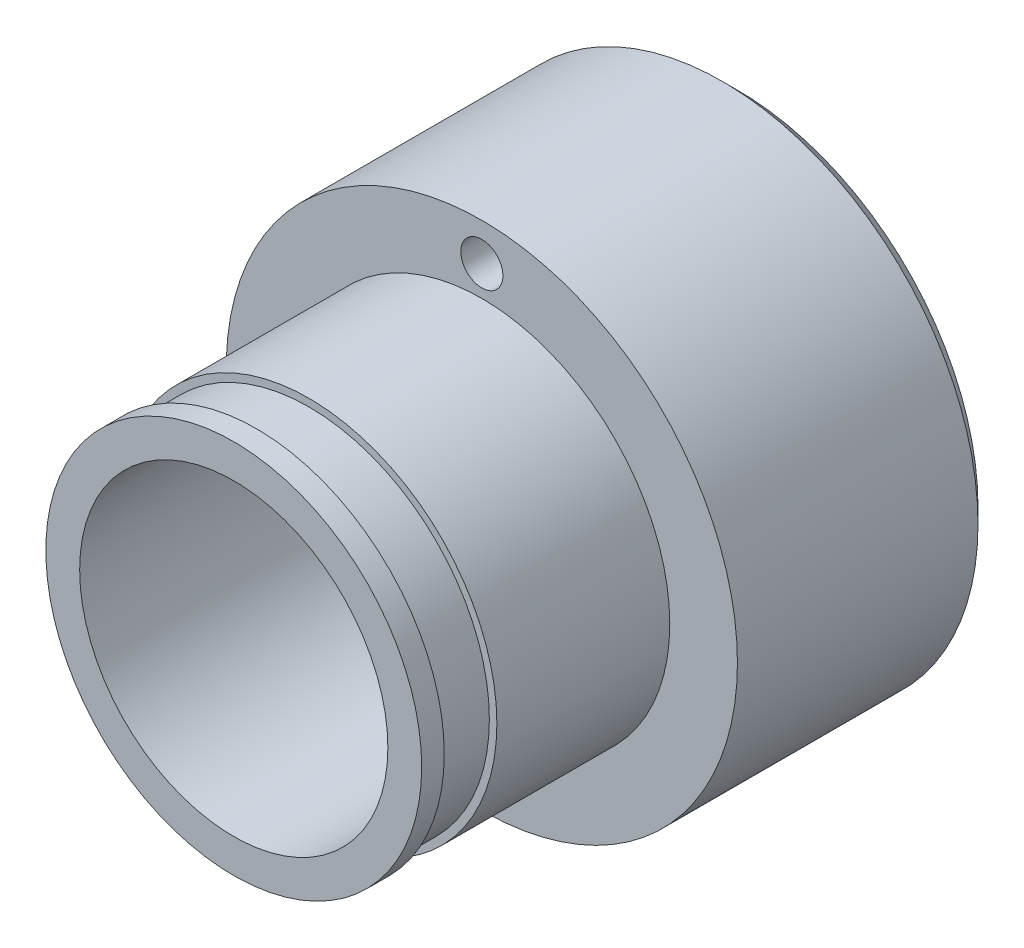
ISO-10303-21;
HEADER;
FILE_DESCRIPTION(('STEP AP214'),'2;1');
FILE_NAME('part.step','',(''),(''),'','','');
FILE_SCHEMA(('AUTOMOTIVE_DESIGN { 1 0 10303 214 1 1 1 1 }'));
ENDSEC;
DATA;
#1=APPLICATION_CONTEXT('core data for automotive mechanical design processes');
#2=APPLICATION_PROTOCOL_DEFINITION('international standard','automotive_design',2000,#1);
#3=PRODUCT_CONTEXT('',#1,'mechanical');
#4=PRODUCT('Part','Part','',(#3));
#5=PRODUCT_RELATED_PRODUCT_CATEGORY('part','',(#4));
#6=PRODUCT_DEFINITION_FORMATION('','',#4);
#7=PRODUCT_DEFINITION_CONTEXT('part definition',#1,'design');
#8=PRODUCT_DEFINITION('design','',#6,#7);
#9=PRODUCT_DEFINITION_SHAPE('','',#8);
#10=(LENGTH_UNIT() NAMED_UNIT(*) SI_UNIT(.MILLI.,.METRE.));
#11=(NAMED_UNIT(*) PLANE_ANGLE_UNIT() SI_UNIT($,.RADIAN.));
#12=(NAMED_UNIT(*) SI_UNIT($,.STERADIAN.) SOLID_ANGLE_UNIT());
#13=UNCERTAINTY_MEASURE_WITH_UNIT(LENGTH_MEASURE(1.E-05),#10,'distance_accuracy_value','');
#14=(GEOMETRIC_REPRESENTATION_CONTEXT(3) GLOBAL_UNCERTAINTY_ASSIGNED_CONTEXT((#13)) GLOBAL_UNIT_ASSIGNED_CONTEXT((#10,
#11,#12)) REPRESENTATION_CONTEXT('',''));
#15=CARTESIAN_POINT('',(0.,0.,0.));
#16=DIRECTION('',(0.,0.,1.));
#17=DIRECTION('',(1.,0.,0.));
#18=AXIS2_PLACEMENT_3D('',#15,#16,#17);
#19=CARTESIAN_POINT('',(0.,0.,17.));
#20=DIRECTION('',(0.,0.,-1.));
#21=DIRECTION('',(-1.,0.,0.));
#22=AXIS2_PLACEMENT_3D('',#19,#20,#21);
#23=CYLINDRICAL_SURFACE('',#22,17.);
#24=CARTESIAN_POINT('',(0.,0.,1.));
#25=DIRECTION('',(0.,0.,1.));
#26=DIRECTION('',(1.,0.,0.));
#27=AXIS2_PLACEMENT_3D('',#24,#25,#26);
#28=CIRCLE('',#27,17.);
#29=CARTESIAN_POINT('',(17.,0.,1.));
#30=VERTEX_POINT('',#29);
#31=EDGE_CURVE('E57',#30,#30,#28,.T.);
#32=ORIENTED_EDGE('',*,*,#31,.T.);
#33=EDGE_LOOP('',(#32));
#34=FACE_BOUND('',#33,.T.);
#35=CARTESIAN_POINT('',(0.,0.,17.));
#36=DIRECTION('',(0.,0.,1.));
#37=DIRECTION('',(1.,0.,0.));
#38=AXIS2_PLACEMENT_3D('',#35,#36,#37);
#39=CIRCLE('',#38,17.);
#40=CARTESIAN_POINT('',(17.,0.,17.));
#41=VERTEX_POINT('',#40);
#42=EDGE_CURVE('E115',#41,#41,#39,.T.);
#43=ORIENTED_EDGE('',*,*,#42,.F.);
#44=EDGE_LOOP('',(#43));
#45=FACE_BOUND('',#44,.T.);
#46=ADVANCED_FACE('F49',(#34,#45),#23,.T.);
#47=CARTESIAN_POINT('',(0.,0.,17.));
#48=DIRECTION('',(0.,0.,1.));
#49=DIRECTION('',(1.,0.,0.));
#50=AXIS2_PLACEMENT_3D('',#47,#48,#49);
#51=PLANE('',#50);
#52=CARTESIAN_POINT('',(0.,14.5,17.));
#53=DIRECTION('',(0.,0.,1.));
#54=DIRECTION('',(1.,0.,0.));
#55=AXIS2_PLACEMENT_3D('',#52,#53,#54);
#56=CIRCLE('',#55,1.4);
#57=CARTESIAN_POINT('',(1.4,14.5,17.));
#58=VERTEX_POINT('',#57);
#59=EDGE_CURVE('E71',#58,#58,#56,.T.);
#60=ORIENTED_EDGE('',*,*,#59,.F.);
#61=EDGE_LOOP('',(#60));
#62=FACE_BOUND('',#61,.T.);
#63=CARTESIAN_POINT('',(0.,0.,17.));
#64=DIRECTION('',(0.,0.,1.));
#65=DIRECTION('',(1.,0.,0.));
#66=AXIS2_PLACEMENT_3D('',#63,#64,#65);
#67=CIRCLE('',#66,12.5);
#68=CARTESIAN_POINT('',(12.5,0.,17.));
#69=VERTEX_POINT('',#68);
#70=EDGE_CURVE('E112',#69,#69,#67,.T.);
#71=ORIENTED_EDGE('',*,*,#70,.F.);
#72=EDGE_LOOP('',(#71));
#73=FACE_BOUND('',#72,.T.);
#74=ORIENTED_EDGE('',*,*,#42,.T.);
#75=EDGE_LOOP('',(#74));
#76=FACE_BOUND('',#75,.T.);
#77=ADVANCED_FACE('F133',(#62,#73,#76),#51,.T.);
#78=CARTESIAN_POINT('',(0.,0.,0.));
#79=DIRECTION('',(0.,0.,1.));
#80=DIRECTION('',(1.,0.,0.));
#81=AXIS2_PLACEMENT_3D('',#78,#79,#80);
#82=PLANE('',#81);
#83=CARTESIAN_POINT('',(0.,0.,0.));
#84=DIRECTION('',(0.,0.,1.));
#85=DIRECTION('',(1.,0.,0.));
#86=AXIS2_PLACEMENT_3D('',#83,#84,#85);
#87=CIRCLE('',#86,16.);
#88=CARTESIAN_POINT('',(16.,0.,0.));
#89=VERTEX_POINT('',#88);
#90=EDGE_CURVE('E11',#89,#89,#87,.F.);
#91=ORIENTED_EDGE('',*,*,#90,.T.);
#92=EDGE_LOOP('',(#91));
#93=FACE_BOUND('',#92,.T.);
#94=ADVANCED_FACE('F137',(#93),#82,.F.);
#95=CARTESIAN_POINT('',(0.,0.,28.5));
#96=DIRECTION('',(0.,0.,-1.));
#97=DIRECTION('',(-1.,0.,0.));
#98=AXIS2_PLACEMENT_3D('',#95,#96,#97);
#99=CYLINDRICAL_SURFACE('',#98,12.5);
#100=CARTESIAN_POINT('',(0.,0.,28.5));
#101=DIRECTION('',(0.,0.,1.));
#102=DIRECTION('',(1.,0.,0.));
#103=AXIS2_PLACEMENT_3D('',#100,#101,#102);
#104=CIRCLE('',#103,12.5);
#105=CARTESIAN_POINT('',(12.5,0.,28.5));
#106=VERTEX_POINT('',#105);
#107=EDGE_CURVE('E108',#106,#106,#104,.T.);
#108=ORIENTED_EDGE('',*,*,#107,.F.);
#109=EDGE_LOOP('',(#108));
#110=FACE_BOUND('',#109,.T.);
#111=ORIENTED_EDGE('',*,*,#70,.T.);
#112=EDGE_LOOP('',(#111));
#113=FACE_BOUND('',#112,.T.);
#114=ADVANCED_FACE('F141',(#110,#113),#99,.T.);
#115=CARTESIAN_POINT('',(0.,0.,28.5));
#116=DIRECTION('',(0.,0.,1.));
#117=DIRECTION('',(1.,0.,0.));
#118=AXIS2_PLACEMENT_3D('',#115,#116,#117);
#119=PLANE('',#118);
#120=CARTESIAN_POINT('',(0.,0.,28.5));
#121=DIRECTION('',(0.,0.,1.));
#122=DIRECTION('',(1.,0.,0.));
#123=AXIS2_PLACEMENT_3D('',#120,#121,#122);
#124=CIRCLE('',#123,12.);
#125=CARTESIAN_POINT('',(12.,0.,28.5));
#126=VERTEX_POINT('',#125);
#127=EDGE_CURVE('E109',#126,#126,#124,.T.);
#128=ORIENTED_EDGE('',*,*,#127,.F.);
#129=EDGE_LOOP('',(#128));
#130=FACE_BOUND('',#129,.T.);
#131=ORIENTED_EDGE('',*,*,#107,.T.);
#132=EDGE_LOOP('',(#131));
#133=FACE_BOUND('',#132,.T.);
#134=ADVANCED_FACE('F146',(#130,#133),#119,.T.);
#135=CARTESIAN_POINT('',(0.,0.,32.));
#136=DIRECTION('',(0.,0.,-1.));
#137=DIRECTION('',(-1.,0.,0.));
#138=AXIS2_PLACEMENT_3D('',#135,#136,#137);
#139=CYLINDRICAL_SURFACE('',#138,12.);
#140=CARTESIAN_POINT('',(0.,0.,32.));
#141=DIRECTION('',(0.,0.,1.));
#142=DIRECTION('',(1.,0.,0.));
#143=AXIS2_PLACEMENT_3D('',#140,#141,#142);
#144=CIRCLE('',#143,12.);
#145=CARTESIAN_POINT('',(12.,0.,32.));
#146=VERTEX_POINT('',#145);
#147=EDGE_CURVE('E103',#146,#146,#144,.T.);
#148=ORIENTED_EDGE('',*,*,#147,.F.);
#149=EDGE_LOOP('',(#148));
#150=FACE_BOUND('',#149,.T.);
#151=ORIENTED_EDGE('',*,*,#127,.T.);
#152=EDGE_LOOP('',(#151));
#153=FACE_BOUND('',#152,.T.);
#154=ADVANCED_FACE('F150',(#150,#153),#139,.T.);
#155=CARTESIAN_POINT('',(0.,0.,33.5));
#156=DIRECTION('',(0.,0.,-1.));
#157=DIRECTION('',(-1.,0.,0.));
#158=AXIS2_PLACEMENT_3D('',#155,#156,#157);
#159=CYLINDRICAL_SURFACE('',#158,12.5);
#160=CARTESIAN_POINT('',(0.,0.,33.5));
#161=DIRECTION('',(0.,0.,1.));
#162=DIRECTION('',(1.,0.,0.));
#163=AXIS2_PLACEMENT_3D('',#160,#161,#162);
#164=CIRCLE('',#163,12.5);
#165=CARTESIAN_POINT('',(12.5,0.,33.5));
#166=VERTEX_POINT('',#165);
#167=EDGE_CURVE('E100',#166,#166,#164,.T.);
#168=ORIENTED_EDGE('',*,*,#167,.F.);
#169=EDGE_LOOP('',(#168));
#170=FACE_BOUND('',#169,.T.);
#171=CARTESIAN_POINT('',(0.,0.,32.));
#172=DIRECTION('',(0.,0.,1.));
#173=DIRECTION('',(1.,0.,0.));
#174=AXIS2_PLACEMENT_3D('',#171,#172,#173);
#175=CIRCLE('',#174,12.5);
#176=CARTESIAN_POINT('',(12.5,0.,32.));
#177=VERTEX_POINT('',#176);
#178=EDGE_CURVE('E99',#177,#177,#175,.T.);
#179=ORIENTED_EDGE('',*,*,#178,.T.);
#180=EDGE_LOOP('',(#179));
#181=FACE_BOUND('',#180,.T.);
#182=ADVANCED_FACE('F154',(#170,#181),#159,.T.);
#183=CARTESIAN_POINT('',(0.,0.,33.5));
#184=DIRECTION('',(0.,0.,1.));
#185=DIRECTION('',(1.,0.,0.));
#186=AXIS2_PLACEMENT_3D('',#183,#184,#185);
#187=PLANE('',#186);
#188=CARTESIAN_POINT('',(0.,0.,33.5));
#189=DIRECTION('',(0.,0.,1.));
#190=DIRECTION('',(1.,0.,0.));
#191=AXIS2_PLACEMENT_3D('',#188,#189,#190);
#192=CIRCLE('',#191,10.25);
#193=CARTESIAN_POINT('',(10.25,0.,33.5));
#194=VERTEX_POINT('',#193);
#195=EDGE_CURVE('E96',#194,#194,#192,.T.);
#196=ORIENTED_EDGE('',*,*,#195,.F.);
#197=EDGE_LOOP('',(#196));
#198=FACE_BOUND('',#197,.T.);
#199=ORIENTED_EDGE('',*,*,#167,.T.);
#200=EDGE_LOOP('',(#199));
#201=FACE_BOUND('',#200,.T.);
#202=ADVANCED_FACE('F158',(#198,#201),#187,.T.);
#203=CARTESIAN_POINT('',(0.,0.,32.));
#204=DIRECTION('',(0.,0.,1.));
#205=DIRECTION('',(1.,0.,0.));
#206=AXIS2_PLACEMENT_3D('',#203,#204,#205);
#207=PLANE('',#206);
#208=ORIENTED_EDGE('',*,*,#147,.T.);
#209=EDGE_LOOP('',(#208));
#210=FACE_BOUND('',#209,.T.);
#211=ORIENTED_EDGE('',*,*,#178,.F.);
#212=EDGE_LOOP('',(#211));
#213=FACE_BOUND('',#212,.T.);
#214=ADVANCED_FACE('F160',(#210,#213),#207,.F.);
#215=CARTESIAN_POINT('',(0.,0.,3.5));
#216=DIRECTION('',(0.,0.,1.));
#217=DIRECTION('',(1.,0.,0.));
#218=AXIS2_PLACEMENT_3D('',#215,#216,#217);
#219=CYLINDRICAL_SURFACE('',#218,10.25);
#220=CARTESIAN_POINT('',(0.,0.,5.5));
#221=DIRECTION('',(0.,0.,1.));
#222=DIRECTION('',(1.,0.,0.));
#223=AXIS2_PLACEMENT_3D('',#220,#221,#222);
#224=CIRCLE('',#223,10.25);
#225=CARTESIAN_POINT('',(10.25,0.,5.5));
#226=VERTEX_POINT('',#225);
#227=EDGE_CURVE('E74',#226,#226,#224,.T.);
#228=ORIENTED_EDGE('',*,*,#227,.F.);
#229=EDGE_LOOP('',(#228));
#230=FACE_BOUND('',#229,.T.);
#231=ORIENTED_EDGE('',*,*,#195,.T.);
#232=EDGE_LOOP('',(#231));
#233=FACE_BOUND('',#232,.T.);
#234=ADVANCED_FACE('F163',(#230,#233),#219,.F.);
#235=CARTESIAN_POINT('',(0.,0.,5.5));
#236=DIRECTION('',(0.,0.,1.));
#237=DIRECTION('',(1.,0.,0.));
#238=AXIS2_PLACEMENT_3D('',#235,#236,#237);
#239=PLANE('',#238);
#240=CARTESIAN_POINT('',(0.,0.,5.5));
#241=DIRECTION('',(0.,0.,1.));
#242=DIRECTION('',(1.,0.,0.));
#243=AXIS2_PLACEMENT_3D('',#240,#241,#242);
#244=CIRCLE('',#243,12.);
#245=CARTESIAN_POINT('',(12.,0.,5.5));
#246=VERTEX_POINT('',#245);
#247=EDGE_CURVE('E82',#246,#246,#244,.T.);
#248=ORIENTED_EDGE('',*,*,#247,.F.);
#249=EDGE_LOOP('',(#248));
#250=FACE_BOUND('',#249,.T.);
#251=ORIENTED_EDGE('',*,*,#227,.T.);
#252=EDGE_LOOP('',(#251));
#253=FACE_BOUND('',#252,.T.);
#254=ADVANCED_FACE('F170',(#250,#253),#239,.F.);
#255=CARTESIAN_POINT('',(0.,0.,3.5));
#256=DIRECTION('',(0.,0.,1.));
#257=DIRECTION('',(1.,0.,0.));
#258=AXIS2_PLACEMENT_3D('',#255,#256,#257);
#259=PLANE('',#258);
#260=CARTESIAN_POINT('',(0.,0.,3.5));
#261=DIRECTION('',(0.,0.,1.));
#262=DIRECTION('',(1.,0.,0.));
#263=AXIS2_PLACEMENT_3D('',#260,#261,#262);
#264=CIRCLE('',#263,12.);
#265=CARTESIAN_POINT('',(12.,0.,3.5));
#266=VERTEX_POINT('',#265);
#267=EDGE_CURVE('E80',#266,#266,#264,.T.);
#268=ORIENTED_EDGE('',*,*,#267,.T.);
#269=EDGE_LOOP('',(#268));
#270=FACE_BOUND('',#269,.T.);
#271=CARTESIAN_POINT('',(0.,0.,3.5));
#272=DIRECTION('',(0.,0.,1.));
#273=DIRECTION('',(1.,0.,0.));
#274=AXIS2_PLACEMENT_3D('',#271,#272,#273);
#275=CIRCLE('',#274,10.25);
#276=CARTESIAN_POINT('',(10.25,0.,3.5));
#277=VERTEX_POINT('',#276);
#278=EDGE_CURVE('E70',#277,#277,#275,.T.);
#279=ORIENTED_EDGE('',*,*,#278,.F.);
#280=EDGE_LOOP('',(#279));
#281=FACE_BOUND('',#280,.T.);
#282=ADVANCED_FACE('F187',(#270,#281),#259,.T.);
#283=CARTESIAN_POINT('',(0.,0.,5.5));
#284=DIRECTION('',(0.,0.,-1.));
#285=DIRECTION('',(-1.,0.,0.));
#286=AXIS2_PLACEMENT_3D('',#283,#284,#285);
#287=CYLINDRICAL_SURFACE('',#286,12.);
#288=ORIENTED_EDGE('',*,*,#247,.T.);
#289=EDGE_LOOP('',(#288));
#290=FACE_BOUND('',#289,.T.);
#291=ORIENTED_EDGE('',*,*,#267,.F.);
#292=EDGE_LOOP('',(#291));
#293=FACE_BOUND('',#292,.T.);
#294=ADVANCED_FACE('F176',(#290,#293),#287,.F.);
#295=CARTESIAN_POINT('',(0.,0.,3.5));
#296=DIRECTION('',(0.,0.,1.));
#297=DIRECTION('',(1.,0.,0.));
#298=AXIS2_PLACEMENT_3D('',#295,#296,#297);
#299=PLANE('',#298);
#300=CARTESIAN_POINT('',(0.,0.,3.5));
#301=DIRECTION('',(0.,0.,1.));
#302=DIRECTION('',(1.,0.,0.));
#303=AXIS2_PLACEMENT_3D('',#300,#301,#302);
#304=CIRCLE('',#303,6.75);
#305=CARTESIAN_POINT('',(6.75,0.,3.5));
#306=VERTEX_POINT('',#305);
#307=EDGE_CURVE('E85',#306,#306,#304,.T.);
#308=ORIENTED_EDGE('',*,*,#307,.T.);
#309=EDGE_LOOP('',(#308));
#310=FACE_BOUND('',#309,.T.);
#311=ADVANCED_FACE('F172',(#310),#299,.T.);
#312=CARTESIAN_POINT('',(0.,0.,2.));
#313=DIRECTION('',(0.,0.,1.));
#314=DIRECTION('',(1.,0.,0.));
#315=AXIS2_PLACEMENT_3D('',#312,#313,#314);
#316=CYLINDRICAL_SURFACE('',#315,6.75);
#317=CARTESIAN_POINT('',(0.,0.,2.));
#318=DIRECTION('',(0.,0.,1.));
#319=DIRECTION('',(1.,0.,0.));
#320=AXIS2_PLACEMENT_3D('',#317,#318,#319);
#321=CIRCLE('',#320,6.75);
#322=CARTESIAN_POINT('',(6.75,0.,2.));
#323=VERTEX_POINT('',#322);
#324=EDGE_CURVE('E88',#323,#323,#321,.T.);
#325=ORIENTED_EDGE('',*,*,#324,.T.);
#326=EDGE_LOOP('',(#325));
#327=FACE_BOUND('',#326,.T.);
#328=ORIENTED_EDGE('',*,*,#307,.F.);
#329=EDGE_LOOP('',(#328));
#330=FACE_BOUND('',#329,.T.);
#331=ADVANCED_FACE('F175',(#327,#330),#316,.T.);
#332=CARTESIAN_POINT('',(0.,0.,2.));
#333=DIRECTION('',(0.,0.,1.));
#334=DIRECTION('',(1.,0.,0.));
#335=AXIS2_PLACEMENT_3D('',#332,#333,#334);
#336=PLANE('',#335);
#337=ORIENTED_EDGE('',*,*,#324,.F.);
#338=EDGE_LOOP('',(#337));
#339=FACE_BOUND('',#338,.T.);
#340=CARTESIAN_POINT('',(0.,0.,2.));
#341=DIRECTION('',(0.,0.,1.));
#342=DIRECTION('',(1.,0.,0.));
#343=AXIS2_PLACEMENT_3D('',#340,#341,#342);
#344=CIRCLE('',#343,10.25);
#345=CARTESIAN_POINT('',(10.25,0.,2.));
#346=VERTEX_POINT('',#345);
#347=EDGE_CURVE('E91',#346,#346,#344,.T.);
#348=ORIENTED_EDGE('',*,*,#347,.T.);
#349=EDGE_LOOP('',(#348));
#350=FACE_BOUND('',#349,.T.);
#351=ADVANCED_FACE('F178',(#339,#350),#336,.T.);
#352=ORIENTED_EDGE('',*,*,#347,.F.);
#353=EDGE_LOOP('',(#352));
#354=FACE_BOUND('',#353,.T.);
#355=ORIENTED_EDGE('',*,*,#278,.T.);
#356=EDGE_LOOP('',(#355));
#357=FACE_BOUND('',#356,.T.);
#358=ADVANCED_FACE('F64',(#354,#357),#219,.F.);
#359=CARTESIAN_POINT('',(0.,14.5,5.));
#360=DIRECTION('',(0.,0.,1.));
#361=DIRECTION('',(1.,0.,0.));
#362=AXIS2_PLACEMENT_3D('',#359,#360,#361);
#363=CONICAL_SURFACE('',#362,1.4,1.02974425867665);
#364=CARTESIAN_POINT('',(0.,14.5,4.15879513336142));
#365=VERTEX_POINT('',#364);
#366=VERTEX_LOOP('',#365);
#367=FACE_BOUND('',#366,.T.);
#368=CARTESIAN_POINT('',(0.,14.5,5.));
#369=DIRECTION('',(0.,0.,1.));
#370=DIRECTION('',(1.,0.,0.));
#371=AXIS2_PLACEMENT_3D('',#368,#369,#370);
#372=CIRCLE('',#371,1.4);
#373=CARTESIAN_POINT('',(1.4,14.5,5.));
#374=VERTEX_POINT('',#373);
#375=EDGE_CURVE('E68',#374,#374,#372,.T.);
#376=ORIENTED_EDGE('',*,*,#375,.T.);
#377=EDGE_LOOP('',(#376));
#378=FACE_BOUND('',#377,.T.);
#379=ADVANCED_FACE('F60',(#367,#378),#363,.F.);
#380=CARTESIAN_POINT('',(0.,14.5,17.));
#381=DIRECTION('',(0.,0.,1.));
#382=DIRECTION('',(1.,0.,0.));
#383=AXIS2_PLACEMENT_3D('',#380,#381,#382);
#384=CYLINDRICAL_SURFACE('',#383,1.4);
#385=ORIENTED_EDGE('',*,*,#375,.F.);
#386=EDGE_LOOP('',(#385));
#387=FACE_BOUND('',#386,.T.);
#388=ORIENTED_EDGE('',*,*,#59,.T.);
#389=EDGE_LOOP('',(#388));
#390=FACE_BOUND('',#389,.T.);
#391=ADVANCED_FACE('F63',(#387,#390),#384,.F.);
#392=CARTESIAN_POINT('',(0.,0.,1.));
#393=DIRECTION('',(0.,0.,1.));
#394=DIRECTION('',(1.,0.,0.));
#395=AXIS2_PLACEMENT_3D('',#392,#393,#394);
#396=CONICAL_SURFACE('',#395,17.,0.78539816339745);
#397=ORIENTED_EDGE('',*,*,#90,.F.);
#398=EDGE_LOOP('',(#397));
#399=FACE_BOUND('',#398,.T.);
#400=ORIENTED_EDGE('',*,*,#31,.F.);
#401=EDGE_LOOP('',(#400));
#402=FACE_BOUND('',#401,.T.);
#403=ADVANCED_FACE('F52',(#399,#402),#396,.T.);
#404=CLOSED_SHELL('',(#46,#77,#94,#114,#134,#154,#182,#202,#214,#234,#254,#282,#294,#311,#331,
#351,#358,#379,#391,#403));
#405=MANIFOLD_SOLID_BREP('B2',#404);
#406=ADVANCED_BREP_SHAPE_REPRESENTATION('',(#18,#405),#14);
#407=SHAPE_DEFINITION_REPRESENTATION(#9,#406);
ENDSEC;
END-ISO-10303-21;
